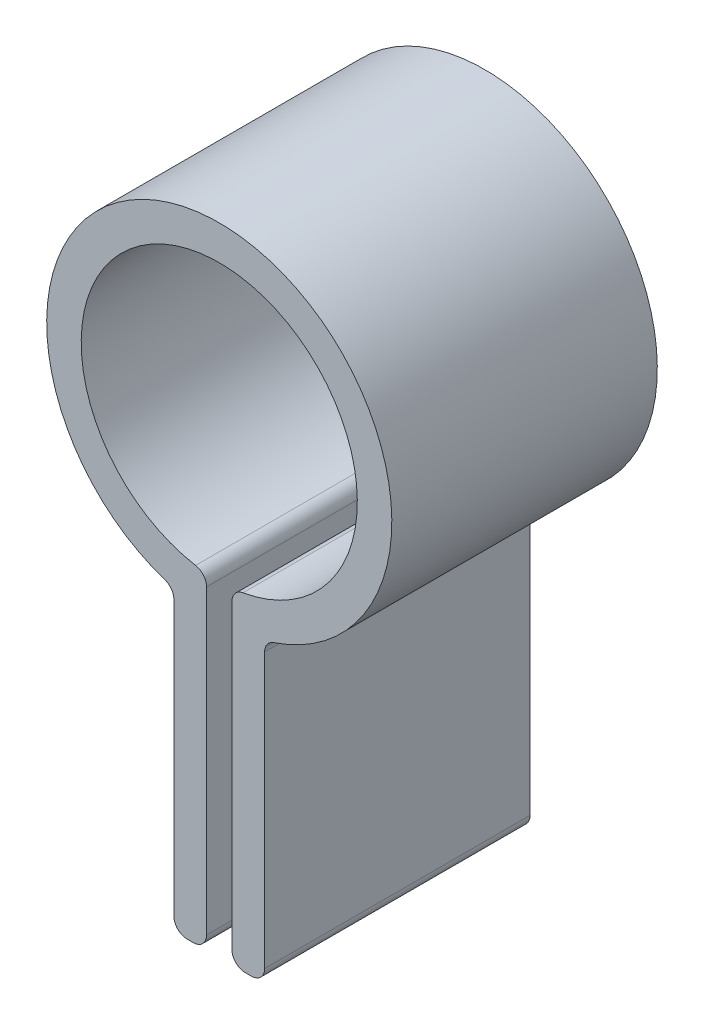
ISO-10303-21;
HEADER;
FILE_DESCRIPTION(('STEP AP214'),'2;1');
FILE_NAME('part.step','',(''),(''),'','','');
FILE_SCHEMA(('AUTOMOTIVE_DESIGN { 1 0 10303 214 1 1 1 1 }'));
ENDSEC;
DATA;
#1=APPLICATION_CONTEXT('core data for automotive mechanical design processes');
#2=APPLICATION_PROTOCOL_DEFINITION('international standard','automotive_design',2000,#1);
#3=PRODUCT_CONTEXT('',#1,'mechanical');
#4=PRODUCT('Part','Part','',(#3));
#5=PRODUCT_RELATED_PRODUCT_CATEGORY('part','',(#4));
#6=PRODUCT_DEFINITION_FORMATION('','',#4);
#7=PRODUCT_DEFINITION_CONTEXT('part definition',#1,'design');
#8=PRODUCT_DEFINITION('design','',#6,#7);
#9=PRODUCT_DEFINITION_SHAPE('','',#8);
#10=(LENGTH_UNIT() NAMED_UNIT(*) SI_UNIT(.MILLI.,.METRE.));
#11=(NAMED_UNIT(*) PLANE_ANGLE_UNIT() SI_UNIT($,.RADIAN.));
#12=(NAMED_UNIT(*) SI_UNIT($,.STERADIAN.) SOLID_ANGLE_UNIT());
#13=UNCERTAINTY_MEASURE_WITH_UNIT(LENGTH_MEASURE(1.E-05),#10,'distance_accuracy_value','');
#14=(GEOMETRIC_REPRESENTATION_CONTEXT(3) GLOBAL_UNCERTAINTY_ASSIGNED_CONTEXT((#13)) GLOBAL_UNIT_ASSIGNED_CONTEXT((#10,
#11,#12)) REPRESENTATION_CONTEXT('',''));
#15=CARTESIAN_POINT('',(0.,0.,0.));
#16=DIRECTION('',(0.,0.,1.));
#17=DIRECTION('',(1.,0.,0.));
#18=AXIS2_PLACEMENT_3D('',#15,#16,#17);
#19=CARTESIAN_POINT('',(2.20980888109747,-6.64204371477806,10.));
#20=DIRECTION('',(0.,0.,-1.));
#21=DIRECTION('',(-1.,0.,0.));
#22=AXIS2_PLACEMENT_3D('',#19,#20,#21);
#23=CYLINDRICAL_SURFACE('',#22,0.5);
#24=CARTESIAN_POINT('',(2.20980888109747,-6.64204371477806,0.));
#25=DIRECTION('',(0.,0.,-1.));
#26=DIRECTION('',(-1.,0.,0.));
#27=AXIS2_PLACEMENT_3D('',#24,#25,#26);
#28=CIRCLE('',#27,0.5);
#29=CARTESIAN_POINT('',(1.70980888109747,-6.64204371477806,0.));
#30=VERTEX_POINT('',#29);
#31=CARTESIAN_POINT('',(2.05196538959051,-6.16761202086534,0.));
#32=VERTEX_POINT('',#31);
#33=EDGE_CURVE('E180',#30,#32,#28,.T.);
#34=ORIENTED_EDGE('',*,*,#33,.T.);
#35=DIRECTION('',(0.,0.,-1.));
#36=VECTOR('',#35,1.);
#37=CARTESIAN_POINT('',(2.05196538959051,-6.16761202086534,10.));
#38=LINE('',#37,#36);
#39=CARTESIAN_POINT('',(2.05196538959051,-6.16761202086534,10.));
#40=VERTEX_POINT('',#39);
#41=EDGE_CURVE('E11',#40,#32,#38,.T.);
#42=ORIENTED_EDGE('',*,*,#41,.F.);
#43=CARTESIAN_POINT('',(2.20980888109747,-6.64204371477806,10.));
#44=DIRECTION('',(0.,0.,-1.));
#45=DIRECTION('',(-1.,0.,0.));
#46=AXIS2_PLACEMENT_3D('',#43,#44,#45);
#47=CIRCLE('',#46,0.5);
#48=CARTESIAN_POINT('',(1.70980888109747,-6.64204371477806,10.));
#49=VERTEX_POINT('',#48);
#50=EDGE_CURVE('E221',#49,#40,#47,.T.);
#51=ORIENTED_EDGE('',*,*,#50,.F.);
#52=DIRECTION('',(0.,0.,-1.));
#53=VECTOR('',#52,1.);
#54=CARTESIAN_POINT('',(1.70980888109747,-6.64204371477806,10.));
#55=LINE('',#54,#53);
#56=EDGE_CURVE('E176',#49,#30,#55,.T.);
#57=ORIENTED_EDGE('',*,*,#56,.T.);
#58=EDGE_LOOP('',(#34,#42,#51,#57));
#59=FACE_BOUND('',#58,.T.);
#60=ADVANCED_FACE('F37',(#59),#23,.F.);
#61=CARTESIAN_POINT('',(0.,0.,10.));
#62=DIRECTION('',(0.,0.,-1.));
#63=DIRECTION('',(-1.,0.,0.));
#64=AXIS2_PLACEMENT_3D('',#61,#62,#63);
#65=CYLINDRICAL_SURFACE('',#64,6.5);
#66=CARTESIAN_POINT('',(0.,0.,0.));
#67=DIRECTION('',(0.,0.,1.));
#68=DIRECTION('',(1.,0.,0.));
#69=AXIS2_PLACEMENT_3D('',#66,#67,#68);
#70=CIRCLE('',#69,6.5);
#71=CARTESIAN_POINT('',(-2.05196538959051,-6.16761202086534,0.));
#72=VERTEX_POINT('',#71);
#73=EDGE_CURVE('E183',#32,#72,#70,.T.);
#74=ORIENTED_EDGE('',*,*,#73,.T.);
#75=DIRECTION('',(0.,0.,-1.));
#76=VECTOR('',#75,1.);
#77=CARTESIAN_POINT('',(-2.05196538959051,-6.16761202086534,10.));
#78=LINE('',#77,#76);
#79=CARTESIAN_POINT('',(-2.05196538959051,-6.16761202086534,10.));
#80=VERTEX_POINT('',#79);
#81=EDGE_CURVE('E45',#80,#72,#78,.T.);
#82=ORIENTED_EDGE('',*,*,#81,.F.);
#83=CARTESIAN_POINT('',(0.,0.,10.));
#84=DIRECTION('',(0.,0.,1.));
#85=DIRECTION('',(1.,0.,0.));
#86=AXIS2_PLACEMENT_3D('',#83,#84,#85);
#87=CIRCLE('',#86,6.5);
#88=EDGE_CURVE('E120',#40,#80,#87,.T.);
#89=ORIENTED_EDGE('',*,*,#88,.F.);
#90=ORIENTED_EDGE('',*,*,#41,.T.);
#91=EDGE_LOOP('',(#74,#82,#89,#90));
#92=FACE_BOUND('',#91,.T.);
#93=ADVANCED_FACE('F306',(#92),#65,.T.);
#94=CARTESIAN_POINT('',(-2.20980888109747,-6.64204371477806,10.));
#95=DIRECTION('',(0.,0.,-1.));
#96=DIRECTION('',(-1.,0.,0.));
#97=AXIS2_PLACEMENT_3D('',#94,#95,#96);
#98=CYLINDRICAL_SURFACE('',#97,0.5);
#99=CARTESIAN_POINT('',(-2.20980888109747,-6.64204371477806,0.));
#100=DIRECTION('',(0.,0.,-1.));
#101=DIRECTION('',(-1.,0.,0.));
#102=AXIS2_PLACEMENT_3D('',#99,#100,#101);
#103=CIRCLE('',#102,0.5);
#104=CARTESIAN_POINT('',(-1.70980888109747,-6.64204371477806,0.));
#105=VERTEX_POINT('',#104);
#106=EDGE_CURVE('E185',#72,#105,#103,.T.);
#107=ORIENTED_EDGE('',*,*,#106,.T.);
#108=DIRECTION('',(0.,0.,-1.));
#109=VECTOR('',#108,1.);
#110=CARTESIAN_POINT('',(-1.70980888109747,-6.64204371477806,10.));
#111=LINE('',#110,#109);
#112=CARTESIAN_POINT('',(-1.70980888109747,-6.64204371477806,10.));
#113=VERTEX_POINT('',#112);
#114=EDGE_CURVE('E243',#113,#105,#111,.T.);
#115=ORIENTED_EDGE('',*,*,#114,.F.);
#116=CARTESIAN_POINT('',(-2.20980888109747,-6.64204371477806,10.));
#117=DIRECTION('',(0.,0.,-1.));
#118=DIRECTION('',(-1.,0.,0.));
#119=AXIS2_PLACEMENT_3D('',#116,#117,#118);
#120=CIRCLE('',#119,0.5);
#121=EDGE_CURVE('E250',#80,#113,#120,.T.);
#122=ORIENTED_EDGE('',*,*,#121,.F.);
#123=ORIENTED_EDGE('',*,*,#81,.T.);
#124=EDGE_LOOP('',(#107,#115,#122,#123));
#125=FACE_BOUND('',#124,.T.);
#126=ADVANCED_FACE('F248',(#125),#98,.F.);
#127=CARTESIAN_POINT('',(-1.70980888109747,-16.9717058403253,10.));
#128=DIRECTION('',(-1.,0.,0.));
#129=DIRECTION('',(0.,0.,1.));
#130=AXIS2_PLACEMENT_3D('',#127,#128,#129);
#131=PLANE('',#130);
#132=DIRECTION('',(0.,1.,0.));
#133=VECTOR('',#132,1.);
#134=CARTESIAN_POINT('',(-1.70980888109747,-16.9717058403253,0.));
#135=LINE('',#134,#133);
#136=CARTESIAN_POINT('',(-1.70980888109747,-16.9717058403253,0.));
#137=VERTEX_POINT('',#136);
#138=EDGE_CURVE('E188',#137,#105,#135,.T.);
#139=ORIENTED_EDGE('',*,*,#138,.F.);
#140=DIRECTION('',(0.,0.,-1.));
#141=VECTOR('',#140,1.);
#142=CARTESIAN_POINT('',(-1.70980888109747,-16.9717058403253,10.));
#143=LINE('',#142,#141);
#144=CARTESIAN_POINT('',(-1.70980888109747,-16.9717058403253,10.));
#145=VERTEX_POINT('',#144);
#146=EDGE_CURVE('E241',#145,#137,#143,.T.);
#147=ORIENTED_EDGE('',*,*,#146,.F.);
#148=DIRECTION('',(0.,1.,0.));
#149=VECTOR('',#148,1.);
#150=CARTESIAN_POINT('',(-1.70980888109747,-16.9717058403253,10.));
#151=LINE('',#150,#149);
#152=EDGE_CURVE('E260',#145,#113,#151,.T.);
#153=ORIENTED_EDGE('',*,*,#152,.T.);
#154=ORIENTED_EDGE('',*,*,#114,.T.);
#155=EDGE_LOOP('',(#139,#147,#153,#154));
#156=FACE_BOUND('',#155,.T.);
#157=ADVANCED_FACE('F257',(#156),#131,.T.);
#158=CARTESIAN_POINT('',(-1.20980888109747,-16.9717058403253,10.));
#159=DIRECTION('',(0.,0.,-1.));
#160=DIRECTION('',(-1.,0.,0.));
#161=AXIS2_PLACEMENT_3D('',#158,#159,#160);
#162=CYLINDRICAL_SURFACE('',#161,0.5);
#163=CARTESIAN_POINT('',(-1.20980888109747,-16.9717058403253,0.));
#164=DIRECTION('',(0.,0.,-1.));
#165=DIRECTION('',(-1.,0.,0.));
#166=AXIS2_PLACEMENT_3D('',#163,#164,#165);
#167=CIRCLE('',#166,0.5);
#168=CARTESIAN_POINT('',(-1.20980888109746,-17.4717058403253,0.));
#169=VERTEX_POINT('',#168);
#170=EDGE_CURVE('E191',#169,#137,#167,.T.);
#171=ORIENTED_EDGE('',*,*,#170,.F.);
#172=DIRECTION('',(0.,0.,-1.));
#173=VECTOR('',#172,1.);
#174=CARTESIAN_POINT('',(-1.20980888109746,-17.4717058403253,10.));
#175=LINE('',#174,#173);
#176=CARTESIAN_POINT('',(-1.20980888109746,-17.4717058403253,10.));
#177=VERTEX_POINT('',#176);
#178=EDGE_CURVE('E239',#177,#169,#175,.T.);
#179=ORIENTED_EDGE('',*,*,#178,.F.);
#180=CARTESIAN_POINT('',(-1.20980888109747,-16.9717058403253,10.));
#181=DIRECTION('',(0.,0.,-1.));
#182=DIRECTION('',(-1.,0.,0.));
#183=AXIS2_PLACEMENT_3D('',#180,#181,#182);
#184=CIRCLE('',#183,0.5);
#185=EDGE_CURVE('E263',#177,#145,#184,.T.);
#186=ORIENTED_EDGE('',*,*,#185,.T.);
#187=ORIENTED_EDGE('',*,*,#146,.T.);
#188=EDGE_LOOP('',(#171,#179,#186,#187));
#189=FACE_BOUND('',#188,.T.);
#190=ADVANCED_FACE('F317',(#189),#162,.T.);
#191=CARTESIAN_POINT('',(-0.978661477673909,-17.4717058403253,10.));
#192=DIRECTION('',(0.,-1.,0.));
#193=DIRECTION('',(0.,0.,-1.));
#194=AXIS2_PLACEMENT_3D('',#191,#192,#193);
#195=PLANE('',#194);
#196=DIRECTION('',(-1.,0.,0.));
#197=VECTOR('',#196,1.);
#198=CARTESIAN_POINT('',(-0.978661477673909,-17.4717058403253,0.));
#199=LINE('',#198,#197);
#200=CARTESIAN_POINT('',(-0.978661477673909,-17.4717058403253,0.));
#201=VERTEX_POINT('',#200);
#202=EDGE_CURVE('E194',#201,#169,#199,.T.);
#203=ORIENTED_EDGE('',*,*,#202,.F.);
#204=DIRECTION('',(0.,0.,-1.));
#205=VECTOR('',#204,1.);
#206=CARTESIAN_POINT('',(-0.978661477673909,-17.4717058403253,10.));
#207=LINE('',#206,#205);
#208=CARTESIAN_POINT('',(-0.978661477673909,-17.4717058403253,10.));
#209=VERTEX_POINT('',#208);
#210=EDGE_CURVE('E237',#209,#201,#207,.T.);
#211=ORIENTED_EDGE('',*,*,#210,.F.);
#212=DIRECTION('',(-1.,0.,0.));
#213=VECTOR('',#212,1.);
#214=CARTESIAN_POINT('',(-0.978661477673909,-17.4717058403253,10.));
#215=LINE('',#214,#213);
#216=EDGE_CURVE('E265',#209,#177,#215,.T.);
#217=ORIENTED_EDGE('',*,*,#216,.T.);
#218=ORIENTED_EDGE('',*,*,#178,.T.);
#219=EDGE_LOOP('',(#203,#211,#217,#218));
#220=FACE_BOUND('',#219,.T.);
#221=ADVANCED_FACE('F320',(#220),#195,.T.);
#222=CARTESIAN_POINT('',(-0.978661477673906,-16.9717058403253,10.));
#223=DIRECTION('',(0.,0.,-1.));
#224=DIRECTION('',(-1.,0.,0.));
#225=AXIS2_PLACEMENT_3D('',#222,#223,#224);
#226=CYLINDRICAL_SURFACE('',#225,0.5);
#227=CARTESIAN_POINT('',(-0.978661477673906,-16.9717058403253,0.));
#228=DIRECTION('',(0.,0.,1.));
#229=DIRECTION('',(1.,0.,0.));
#230=AXIS2_PLACEMENT_3D('',#227,#228,#229);
#231=CIRCLE('',#230,0.5);
#232=CARTESIAN_POINT('',(-0.478661477673905,-16.9717058403253,0.));
#233=VERTEX_POINT('',#232);
#234=EDGE_CURVE('E197',#201,#233,#231,.T.);
#235=ORIENTED_EDGE('',*,*,#234,.T.);
#236=DIRECTION('',(0.,0.,-1.));
#237=VECTOR('',#236,1.);
#238=CARTESIAN_POINT('',(-0.478661477673905,-16.9717058403253,10.));
#239=LINE('',#238,#237);
#240=CARTESIAN_POINT('',(-0.478661477673905,-16.9717058403253,10.));
#241=VERTEX_POINT('',#240);
#242=EDGE_CURVE('E235',#241,#233,#239,.T.);
#243=ORIENTED_EDGE('',*,*,#242,.F.);
#244=CARTESIAN_POINT('',(-0.978661477673906,-16.9717058403253,10.));
#245=DIRECTION('',(0.,0.,1.));
#246=DIRECTION('',(1.,0.,0.));
#247=AXIS2_PLACEMENT_3D('',#244,#245,#246);
#248=CIRCLE('',#247,0.5);
#249=EDGE_CURVE('E272',#209,#241,#248,.T.);
#250=ORIENTED_EDGE('',*,*,#249,.F.);
#251=ORIENTED_EDGE('',*,*,#210,.T.);
#252=EDGE_LOOP('',(#235,#243,#250,#251));
#253=FACE_BOUND('',#252,.T.);
#254=ADVANCED_FACE('F324',(#253),#226,.T.);
#255=CARTESIAN_POINT('',(-0.478661477673906,-5.61535588472513,10.));
#256=DIRECTION('',(1.,0.,0.));
#257=DIRECTION('',(0.,0.,-1.));
#258=AXIS2_PLACEMENT_3D('',#255,#256,#257);
#259=PLANE('',#258);
#260=DIRECTION('',(0.,-1.,0.));
#261=VECTOR('',#260,1.);
#262=CARTESIAN_POINT('',(-0.478661477673906,-5.61535588472513,0.));
#263=LINE('',#262,#261);
#264=CARTESIAN_POINT('',(-0.478661477673906,-5.61535588472513,0.));
#265=VERTEX_POINT('',#264);
#266=EDGE_CURVE('E200',#265,#233,#263,.T.);
#267=ORIENTED_EDGE('',*,*,#266,.F.);
#268=DIRECTION('',(0.,0.,-1.));
#269=VECTOR('',#268,1.);
#270=CARTESIAN_POINT('',(-0.478661477673906,-5.61535588472513,10.));
#271=LINE('',#270,#269);
#272=CARTESIAN_POINT('',(-0.478661477673906,-5.61535588472513,10.));
#273=VERTEX_POINT('',#272);
#274=EDGE_CURVE('E233',#273,#265,#271,.T.);
#275=ORIENTED_EDGE('',*,*,#274,.F.);
#276=DIRECTION('',(0.,-1.,0.));
#277=VECTOR('',#276,1.);
#278=CARTESIAN_POINT('',(-0.478661477673906,-5.61535588472513,10.));
#279=LINE('',#278,#277);
#280=EDGE_CURVE('E274',#273,#241,#279,.T.);
#281=ORIENTED_EDGE('',*,*,#280,.T.);
#282=ORIENTED_EDGE('',*,*,#242,.T.);
#283=EDGE_LOOP('',(#267,#275,#281,#282));
#284=FACE_BOUND('',#283,.T.);
#285=ADVANCED_FACE('F328',(#284),#259,.T.);
#286=CARTESIAN_POINT('',(-0.978661477673906,-5.61535588472513,10.));
#287=DIRECTION('',(0.,0.,-1.));
#288=DIRECTION('',(-1.,0.,0.));
#289=AXIS2_PLACEMENT_3D('',#286,#287,#288);
#290=CYLINDRICAL_SURFACE('',#289,0.500000000000001);
#291=CARTESIAN_POINT('',(-0.978661477673906,-5.61535588472513,0.));
#292=DIRECTION('',(0.,0.,-1.));
#293=DIRECTION('',(-1.,0.,0.));
#294=AXIS2_PLACEMENT_3D('',#291,#292,#293);
#295=CIRCLE('',#294,0.500000000000001);
#296=CARTESIAN_POINT('',(-0.892813979632335,-5.12278080711766,0.));
#297=VERTEX_POINT('',#296);
#298=EDGE_CURVE('E203',#297,#265,#295,.T.);
#299=ORIENTED_EDGE('',*,*,#298,.F.);
#300=DIRECTION('',(0.,0.,-1.));
#301=VECTOR('',#300,1.);
#302=CARTESIAN_POINT('',(-0.892813979632335,-5.12278080711766,10.));
#303=LINE('',#302,#301);
#304=CARTESIAN_POINT('',(-0.892813979632335,-5.12278080711766,10.));
#305=VERTEX_POINT('',#304);
#306=EDGE_CURVE('E231',#305,#297,#303,.T.);
#307=ORIENTED_EDGE('',*,*,#306,.F.);
#308=CARTESIAN_POINT('',(-0.978661477673906,-5.61535588472513,10.));
#309=DIRECTION('',(0.,0.,-1.));
#310=DIRECTION('',(-1.,0.,0.));
#311=AXIS2_PLACEMENT_3D('',#308,#309,#310);
#312=CIRCLE('',#311,0.500000000000001);
#313=EDGE_CURVE('E277',#305,#273,#312,.T.);
#314=ORIENTED_EDGE('',*,*,#313,.T.);
#315=ORIENTED_EDGE('',*,*,#274,.T.);
#316=EDGE_LOOP('',(#299,#307,#314,#315));
#317=FACE_BOUND('',#316,.T.);
#318=ADVANCED_FACE('F332',(#317),#290,.T.);
#319=CARTESIAN_POINT('',(0.,0.,10.));
#320=DIRECTION('',(0.,0.,-1.));
#321=DIRECTION('',(-1.,0.,0.));
#322=AXIS2_PLACEMENT_3D('',#319,#320,#321);
#323=CYLINDRICAL_SURFACE('',#322,5.2);
#324=CARTESIAN_POINT('',(0.,0.,0.));
#325=DIRECTION('',(0.,0.,1.));
#326=DIRECTION('',(1.,0.,0.));
#327=AXIS2_PLACEMENT_3D('',#324,#325,#326);
#328=CIRCLE('',#327,5.2);
#329=CARTESIAN_POINT('',(0.892813979632335,-5.12278080711766,0.));
#330=VERTEX_POINT('',#329);
#331=EDGE_CURVE('E206',#330,#297,#328,.T.);
#332=ORIENTED_EDGE('',*,*,#331,.F.);
#333=DIRECTION('',(0.,0.,-1.));
#334=VECTOR('',#333,1.);
#335=CARTESIAN_POINT('',(0.892813979632335,-5.12278080711766,10.));
#336=LINE('',#335,#334);
#337=CARTESIAN_POINT('',(0.892813979632335,-5.12278080711766,10.));
#338=VERTEX_POINT('',#337);
#339=EDGE_CURVE('E229',#338,#330,#336,.T.);
#340=ORIENTED_EDGE('',*,*,#339,.F.);
#341=CARTESIAN_POINT('',(0.,0.,10.));
#342=DIRECTION('',(0.,0.,1.));
#343=DIRECTION('',(1.,0.,0.));
#344=AXIS2_PLACEMENT_3D('',#341,#342,#343);
#345=CIRCLE('',#344,5.2);
#346=EDGE_CURVE('E280',#338,#305,#345,.T.);
#347=ORIENTED_EDGE('',*,*,#346,.T.);
#348=ORIENTED_EDGE('',*,*,#306,.T.);
#349=EDGE_LOOP('',(#332,#340,#347,#348));
#350=FACE_BOUND('',#349,.T.);
#351=ADVANCED_FACE('F336',(#350),#323,.F.);
#352=CARTESIAN_POINT('',(0.978661477673906,-5.61535588472513,10.));
#353=DIRECTION('',(0.,0.,-1.));
#354=DIRECTION('',(-1.,0.,0.));
#355=AXIS2_PLACEMENT_3D('',#352,#353,#354);
#356=CYLINDRICAL_SURFACE('',#355,0.500000000000001);
#357=CARTESIAN_POINT('',(0.978661477673906,-5.61535588472513,0.));
#358=DIRECTION('',(0.,0.,-1.));
#359=DIRECTION('',(-1.,0.,0.));
#360=AXIS2_PLACEMENT_3D('',#357,#358,#359);
#361=CIRCLE('',#360,0.500000000000001);
#362=CARTESIAN_POINT('',(0.478661477673905,-5.61535588472513,0.));
#363=VERTEX_POINT('',#362);
#364=EDGE_CURVE('E209',#363,#330,#361,.T.);
#365=ORIENTED_EDGE('',*,*,#364,.F.);
#366=DIRECTION('',(0.,0.,-1.));
#367=VECTOR('',#366,1.);
#368=CARTESIAN_POINT('',(0.478661477673905,-5.61535588472513,10.));
#369=LINE('',#368,#367);
#370=CARTESIAN_POINT('',(0.478661477673905,-5.61535588472513,10.));
#371=VERTEX_POINT('',#370);
#372=EDGE_CURVE('E227',#371,#363,#369,.T.);
#373=ORIENTED_EDGE('',*,*,#372,.F.);
#374=CARTESIAN_POINT('',(0.978661477673906,-5.61535588472513,10.));
#375=DIRECTION('',(0.,0.,-1.));
#376=DIRECTION('',(-1.,0.,0.));
#377=AXIS2_PLACEMENT_3D('',#374,#375,#376);
#378=CIRCLE('',#377,0.500000000000001);
#379=EDGE_CURVE('E283',#371,#338,#378,.T.);
#380=ORIENTED_EDGE('',*,*,#379,.T.);
#381=ORIENTED_EDGE('',*,*,#339,.T.);
#382=EDGE_LOOP('',(#365,#373,#380,#381));
#383=FACE_BOUND('',#382,.T.);
#384=ADVANCED_FACE('F340',(#383),#356,.T.);
#385=CARTESIAN_POINT('',(0.478661477673906,-5.61535588472513,10.));
#386=DIRECTION('',(1.,0.,0.));
#387=DIRECTION('',(0.,0.,-1.));
#388=AXIS2_PLACEMENT_3D('',#385,#386,#387);
#389=PLANE('',#388);
#390=DIRECTION('',(0.,-1.,0.));
#391=VECTOR('',#390,1.);
#392=CARTESIAN_POINT('',(0.478661477673906,-5.61535588472513,0.));
#393=LINE('',#392,#391);
#394=CARTESIAN_POINT('',(0.478661477673906,-16.9717058403253,0.));
#395=VERTEX_POINT('',#394);
#396=EDGE_CURVE('E212',#363,#395,#393,.T.);
#397=ORIENTED_EDGE('',*,*,#396,.T.);
#398=DIRECTION('',(0.,0.,-1.));
#399=VECTOR('',#398,1.);
#400=CARTESIAN_POINT('',(0.478661477673906,-16.9717058403253,10.));
#401=LINE('',#400,#399);
#402=CARTESIAN_POINT('',(0.478661477673906,-16.9717058403253,10.));
#403=VERTEX_POINT('',#402);
#404=EDGE_CURVE('E225',#403,#395,#401,.T.);
#405=ORIENTED_EDGE('',*,*,#404,.F.);
#406=DIRECTION('',(0.,-1.,0.));
#407=VECTOR('',#406,1.);
#408=CARTESIAN_POINT('',(0.478661477673906,-5.61535588472513,10.));
#409=LINE('',#408,#407);
#410=EDGE_CURVE('E286',#371,#403,#409,.T.);
#411=ORIENTED_EDGE('',*,*,#410,.F.);
#412=ORIENTED_EDGE('',*,*,#372,.T.);
#413=EDGE_LOOP('',(#397,#405,#411,#412));
#414=FACE_BOUND('',#413,.T.);
#415=ADVANCED_FACE('F344',(#414),#389,.F.);
#416=CARTESIAN_POINT('',(0.978661477673906,-16.9717058403253,10.));
#417=DIRECTION('',(0.,0.,-1.));
#418=DIRECTION('',(-1.,0.,0.));
#419=AXIS2_PLACEMENT_3D('',#416,#417,#418);
#420=CYLINDRICAL_SURFACE('',#419,0.5);
#421=CARTESIAN_POINT('',(0.978661477673906,-16.9717058403253,0.));
#422=DIRECTION('',(0.,0.,-1.));
#423=DIRECTION('',(-1.,0.,0.));
#424=AXIS2_PLACEMENT_3D('',#421,#422,#423);
#425=CIRCLE('',#424,0.5);
#426=CARTESIAN_POINT('',(0.978661477673909,-17.4717058403253,0.));
#427=VERTEX_POINT('',#426);
#428=EDGE_CURVE('E215',#427,#395,#425,.T.);
#429=ORIENTED_EDGE('',*,*,#428,.F.);
#430=DIRECTION('',(0.,0.,-1.));
#431=VECTOR('',#430,1.);
#432=CARTESIAN_POINT('',(0.978661477673909,-17.4717058403253,10.));
#433=LINE('',#432,#431);
#434=CARTESIAN_POINT('',(0.978661477673909,-17.4717058403253,10.));
#435=VERTEX_POINT('',#434);
#436=EDGE_CURVE('E171',#435,#427,#433,.T.);
#437=ORIENTED_EDGE('',*,*,#436,.F.);
#438=CARTESIAN_POINT('',(0.978661477673906,-16.9717058403253,10.));
#439=DIRECTION('',(0.,0.,-1.));
#440=DIRECTION('',(-1.,0.,0.));
#441=AXIS2_PLACEMENT_3D('',#438,#439,#440);
#442=CIRCLE('',#441,0.5);
#443=EDGE_CURVE('E164',#435,#403,#442,.T.);
#444=ORIENTED_EDGE('',*,*,#443,.T.);
#445=ORIENTED_EDGE('',*,*,#404,.T.);
#446=EDGE_LOOP('',(#429,#437,#444,#445));
#447=FACE_BOUND('',#446,.T.);
#448=ADVANCED_FACE('F289',(#447),#420,.T.);
#449=CARTESIAN_POINT('',(0.978661477673909,-17.4717058403253,10.));
#450=DIRECTION('',(0.,1.,0.));
#451=DIRECTION('',(0.,0.,1.));
#452=AXIS2_PLACEMENT_3D('',#449,#450,#451);
#453=PLANE('',#452);
#454=DIRECTION('',(1.,0.,0.));
#455=VECTOR('',#454,1.);
#456=CARTESIAN_POINT('',(0.978661477673909,-17.4717058403253,0.));
#457=LINE('',#456,#455);
#458=CARTESIAN_POINT('',(1.20980888109746,-17.4717058403253,0.));
#459=VERTEX_POINT('',#458);
#460=EDGE_CURVE('E170',#427,#459,#457,.T.);
#461=ORIENTED_EDGE('',*,*,#460,.T.);
#462=DIRECTION('',(0.,0.,-1.));
#463=VECTOR('',#462,1.);
#464=CARTESIAN_POINT('',(1.20980888109746,-17.4717058403253,10.));
#465=LINE('',#464,#463);
#466=CARTESIAN_POINT('',(1.20980888109746,-17.4717058403253,10.));
#467=VERTEX_POINT('',#466);
#468=EDGE_CURVE('E167',#467,#459,#465,.T.);
#469=ORIENTED_EDGE('',*,*,#468,.F.);
#470=DIRECTION('',(1.,0.,0.));
#471=VECTOR('',#470,1.);
#472=CARTESIAN_POINT('',(0.978661477673909,-17.4717058403253,10.));
#473=LINE('',#472,#471);
#474=EDGE_CURVE('E158',#435,#467,#473,.T.);
#475=ORIENTED_EDGE('',*,*,#474,.F.);
#476=ORIENTED_EDGE('',*,*,#436,.T.);
#477=EDGE_LOOP('',(#461,#469,#475,#476));
#478=FACE_BOUND('',#477,.T.);
#479=ADVANCED_FACE('F168',(#478),#453,.F.);
#480=CARTESIAN_POINT('',(1.20980888109747,-16.9717058403253,10.));
#481=DIRECTION('',(0.,0.,-1.));
#482=DIRECTION('',(-1.,0.,0.));
#483=AXIS2_PLACEMENT_3D('',#480,#481,#482);
#484=CYLINDRICAL_SURFACE('',#483,0.5);
#485=CARTESIAN_POINT('',(1.20980888109747,-16.9717058403253,0.));
#486=DIRECTION('',(0.,0.,1.));
#487=DIRECTION('',(1.,0.,0.));
#488=AXIS2_PLACEMENT_3D('',#485,#486,#487);
#489=CIRCLE('',#488,0.5);
#490=CARTESIAN_POINT('',(1.70980888109747,-16.9717058403253,0.));
#491=VERTEX_POINT('',#490);
#492=EDGE_CURVE('E106',#459,#491,#489,.T.);
#493=ORIENTED_EDGE('',*,*,#492,.T.);
#494=DIRECTION('',(0.,0.,-1.));
#495=VECTOR('',#494,1.);
#496=CARTESIAN_POINT('',(1.70980888109747,-16.9717058403253,10.));
#497=LINE('',#496,#495);
#498=CARTESIAN_POINT('',(1.70980888109747,-16.9717058403253,10.));
#499=VERTEX_POINT('',#498);
#500=EDGE_CURVE('E172',#499,#491,#497,.T.);
#501=ORIENTED_EDGE('',*,*,#500,.F.);
#502=CARTESIAN_POINT('',(1.20980888109747,-16.9717058403253,10.));
#503=DIRECTION('',(0.,0.,1.));
#504=DIRECTION('',(1.,0.,0.));
#505=AXIS2_PLACEMENT_3D('',#502,#503,#504);
#506=CIRCLE('',#505,0.5);
#507=EDGE_CURVE('E162',#467,#499,#506,.T.);
#508=ORIENTED_EDGE('',*,*,#507,.F.);
#509=ORIENTED_EDGE('',*,*,#468,.T.);
#510=EDGE_LOOP('',(#493,#501,#508,#509));
#511=FACE_BOUND('',#510,.T.);
#512=ADVANCED_FACE('F174',(#511),#484,.T.);
#513=CARTESIAN_POINT('',(1.70980888109747,-16.9717058403253,10.));
#514=DIRECTION('',(-1.,0.,0.));
#515=DIRECTION('',(0.,0.,1.));
#516=AXIS2_PLACEMENT_3D('',#513,#514,#515);
#517=PLANE('',#516);
#518=DIRECTION('',(0.,1.,0.));
#519=VECTOR('',#518,1.);
#520=CARTESIAN_POINT('',(1.70980888109747,-16.9717058403253,0.));
#521=LINE('',#520,#519);
#522=EDGE_CURVE('E112',#491,#30,#521,.T.);
#523=ORIENTED_EDGE('',*,*,#522,.T.);
#524=ORIENTED_EDGE('',*,*,#56,.F.);
#525=DIRECTION('',(0.,1.,0.));
#526=VECTOR('',#525,1.);
#527=CARTESIAN_POINT('',(1.70980888109747,-16.9717058403253,10.));
#528=LINE('',#527,#526);
#529=EDGE_CURVE('E53',#499,#49,#528,.T.);
#530=ORIENTED_EDGE('',*,*,#529,.F.);
#531=ORIENTED_EDGE('',*,*,#500,.T.);
#532=EDGE_LOOP('',(#523,#524,#530,#531));
#533=FACE_BOUND('',#532,.T.);
#534=ADVANCED_FACE('F295',(#533),#517,.F.);
#535=CARTESIAN_POINT('',(2.20980888109747,-6.64204371477806,10.));
#536=DIRECTION('',(0.,0.,-1.));
#537=DIRECTION('',(-1.,0.,0.));
#538=AXIS2_PLACEMENT_3D('',#535,#536,#537);
#539=PLANE('',#538);
#540=ORIENTED_EDGE('',*,*,#50,.T.);
#541=ORIENTED_EDGE('',*,*,#88,.T.);
#542=ORIENTED_EDGE('',*,*,#121,.T.);
#543=ORIENTED_EDGE('',*,*,#152,.F.);
#544=ORIENTED_EDGE('',*,*,#185,.F.);
#545=ORIENTED_EDGE('',*,*,#216,.F.);
#546=ORIENTED_EDGE('',*,*,#249,.T.);
#547=ORIENTED_EDGE('',*,*,#280,.F.);
#548=ORIENTED_EDGE('',*,*,#313,.F.);
#549=ORIENTED_EDGE('',*,*,#346,.F.);
#550=ORIENTED_EDGE('',*,*,#379,.F.);
#551=ORIENTED_EDGE('',*,*,#410,.T.);
#552=ORIENTED_EDGE('',*,*,#443,.F.);
#553=ORIENTED_EDGE('',*,*,#474,.T.);
#554=ORIENTED_EDGE('',*,*,#507,.T.);
#555=ORIENTED_EDGE('',*,*,#529,.T.);
#556=EDGE_LOOP('',(#540,#541,#542,#543,#544,#545,#546,#547,#548,#549,#550,#551,#552,#553,#554,#555));
#557=FACE_BOUND('',#556,.T.);
#558=ADVANCED_FACE('F160',(#557),#539,.F.);
#559=CARTESIAN_POINT('',(2.20980888109747,-6.64204371477806,0.));
#560=DIRECTION('',(0.,0.,-1.));
#561=DIRECTION('',(-1.,0.,0.));
#562=AXIS2_PLACEMENT_3D('',#559,#560,#561);
#563=PLANE('',#562);
#564=ORIENTED_EDGE('',*,*,#33,.F.);
#565=ORIENTED_EDGE('',*,*,#522,.F.);
#566=ORIENTED_EDGE('',*,*,#492,.F.);
#567=ORIENTED_EDGE('',*,*,#460,.F.);
#568=ORIENTED_EDGE('',*,*,#428,.T.);
#569=ORIENTED_EDGE('',*,*,#396,.F.);
#570=ORIENTED_EDGE('',*,*,#364,.T.);
#571=ORIENTED_EDGE('',*,*,#331,.T.);
#572=ORIENTED_EDGE('',*,*,#298,.T.);
#573=ORIENTED_EDGE('',*,*,#266,.T.);
#574=ORIENTED_EDGE('',*,*,#234,.F.);
#575=ORIENTED_EDGE('',*,*,#202,.T.);
#576=ORIENTED_EDGE('',*,*,#170,.T.);
#577=ORIENTED_EDGE('',*,*,#138,.T.);
#578=ORIENTED_EDGE('',*,*,#106,.F.);
#579=ORIENTED_EDGE('',*,*,#73,.F.);
#580=EDGE_LOOP('',(#564,#565,#566,#567,#568,#569,#570,#571,#572,#573,#574,#575,#576,#577,#578,#579));
#581=FACE_BOUND('',#580,.T.);
#582=ADVANCED_FACE('F253',(#581),#563,.T.);
#583=CLOSED_SHELL('',(#60,#93,#126,#157,#190,#221,#254,#285,#318,#351,#384,#415,#448,#479,#512,
#534,#558,#582));
#584=MANIFOLD_SOLID_BREP('B2',#583);
#585=ADVANCED_BREP_SHAPE_REPRESENTATION('',(#18,#584),#14);
#586=SHAPE_DEFINITION_REPRESENTATION(#9,#585);
ENDSEC;
END-ISO-10303-21;
